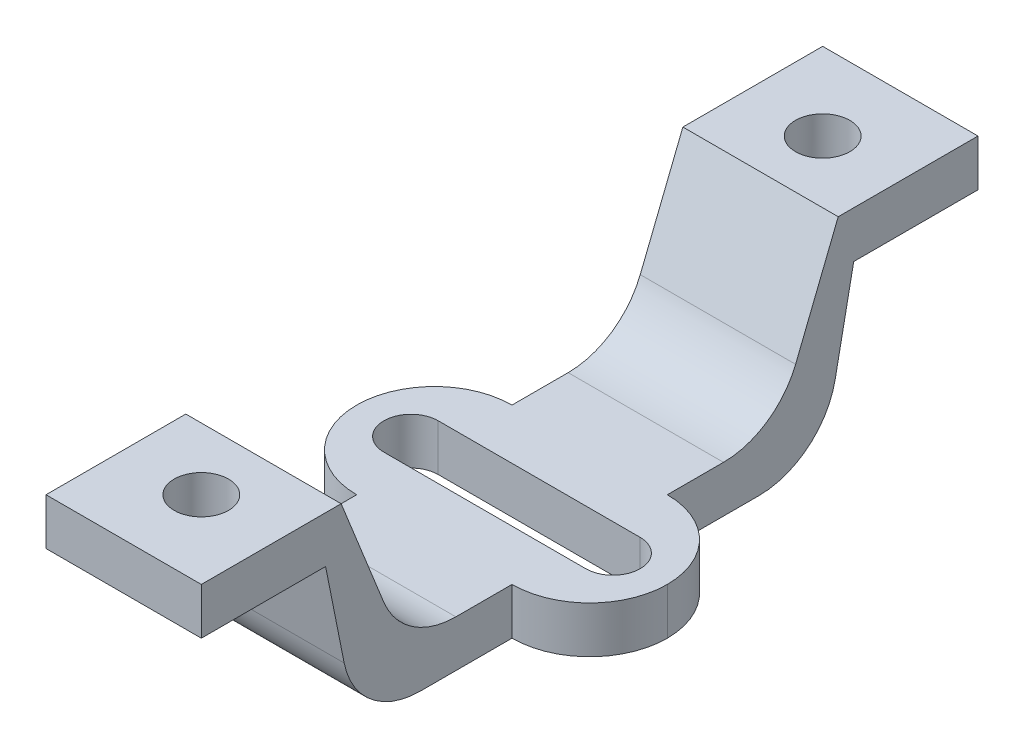
ISO-10303-21;
HEADER;
FILE_DESCRIPTION(('STEP AP214'),'2;1');
FILE_NAME('part.step','',(''),(''),'','','');
FILE_SCHEMA(('AUTOMOTIVE_DESIGN { 1 0 10303 214 1 1 1 1 }'));
ENDSEC;
DATA;
#1=APPLICATION_CONTEXT('core data for automotive mechanical design processes');
#2=APPLICATION_PROTOCOL_DEFINITION('international standard','automotive_design',2000,#1);
#3=PRODUCT_CONTEXT('',#1,'mechanical');
#4=PRODUCT('Part','Part','',(#3));
#5=PRODUCT_RELATED_PRODUCT_CATEGORY('part','',(#4));
#6=PRODUCT_DEFINITION_FORMATION('','',#4);
#7=PRODUCT_DEFINITION_CONTEXT('part definition',#1,'design');
#8=PRODUCT_DEFINITION('design','',#6,#7);
#9=PRODUCT_DEFINITION_SHAPE('','',#8);
#10=(LENGTH_UNIT() NAMED_UNIT(*) SI_UNIT(.MILLI.,.METRE.));
#11=(NAMED_UNIT(*) PLANE_ANGLE_UNIT() SI_UNIT($,.RADIAN.));
#12=(NAMED_UNIT(*) SI_UNIT($,.STERADIAN.) SOLID_ANGLE_UNIT());
#13=UNCERTAINTY_MEASURE_WITH_UNIT(LENGTH_MEASURE(1.E-05),#10,'distance_accuracy_value','');
#14=(GEOMETRIC_REPRESENTATION_CONTEXT(3) GLOBAL_UNCERTAINTY_ASSIGNED_CONTEXT((#13)) GLOBAL_UNIT_ASSIGNED_CONTEXT((#10,
#11,#12)) REPRESENTATION_CONTEXT('',''));
#15=CARTESIAN_POINT('',(0.,0.,0.));
#16=DIRECTION('',(0.,0.,1.));
#17=DIRECTION('',(1.,0.,0.));
#18=AXIS2_PLACEMENT_3D('',#15,#16,#17);
#19=CARTESIAN_POINT('',(6.5,3.,0.));
#20=DIRECTION('',(0.,-1.,0.));
#21=DIRECTION('',(0.,0.,-1.));
#22=AXIS2_PLACEMENT_3D('',#19,#20,#21);
#23=CYLINDRICAL_SURFACE('',#22,1.75);
#24=CARTESIAN_POINT('',(6.5,0.,0.));
#25=DIRECTION('',(0.,1.,0.));
#26=DIRECTION('',(0.,0.,1.));
#27=AXIS2_PLACEMENT_3D('',#24,#25,#26);
#28=CIRCLE('',#27,1.75);
#29=CARTESIAN_POINT('',(6.5,0.,1.75));
#30=VERTEX_POINT('',#29);
#31=CARTESIAN_POINT('',(6.5,0.,-1.75));
#32=VERTEX_POINT('',#31);
#33=EDGE_CURVE('E337',#30,#32,#28,.T.);
#34=ORIENTED_EDGE('',*,*,#33,.F.);
#35=DIRECTION('',(0.,-1.,0.));
#36=VECTOR('',#35,1.);
#37=CARTESIAN_POINT('',(6.5,3.,1.75));
#38=LINE('',#37,#36);
#39=CARTESIAN_POINT('',(6.5,3.,1.75));
#40=VERTEX_POINT('',#39);
#41=EDGE_CURVE('E365',#40,#30,#38,.T.);
#42=ORIENTED_EDGE('',*,*,#41,.F.);
#43=CARTESIAN_POINT('',(6.5,3.,0.));
#44=DIRECTION('',(0.,1.,0.));
#45=DIRECTION('',(0.,0.,1.));
#46=AXIS2_PLACEMENT_3D('',#43,#44,#45);
#47=CIRCLE('',#46,1.75);
#48=CARTESIAN_POINT('',(6.5,3.,-1.75));
#49=VERTEX_POINT('',#48);
#50=EDGE_CURVE('E338',#40,#49,#47,.T.);
#51=ORIENTED_EDGE('',*,*,#50,.T.);
#52=DIRECTION('',(0.,-1.,0.));
#53=VECTOR('',#52,1.);
#54=CARTESIAN_POINT('',(6.5,3.,-1.75));
#55=LINE('',#54,#53);
#56=EDGE_CURVE('E349',#49,#32,#55,.T.);
#57=ORIENTED_EDGE('',*,*,#56,.T.);
#58=EDGE_LOOP('',(#34,#42,#51,#57));
#59=FACE_BOUND('',#58,.T.);
#60=ADVANCED_FACE('F39',(#59),#23,.F.);
#61=CARTESIAN_POINT('',(0.,3.,1.75));
#62=DIRECTION('',(0.,0.,1.));
#63=DIRECTION('',(1.,0.,0.));
#64=AXIS2_PLACEMENT_3D('',#61,#62,#63);
#65=PLANE('',#64);
#66=DIRECTION('',(-1.,0.,0.));
#67=VECTOR('',#66,1.);
#68=CARTESIAN_POINT('',(0.,0.,1.75));
#69=LINE('',#68,#67);
#70=CARTESIAN_POINT('',(-6.5,0.,1.75));
#71=VERTEX_POINT('',#70);
#72=EDGE_CURVE('E352',#30,#71,#69,.T.);
#73=ORIENTED_EDGE('',*,*,#72,.T.);
#74=DIRECTION('',(0.,-1.,0.));
#75=VECTOR('',#74,1.);
#76=CARTESIAN_POINT('',(-6.5,3.,1.75));
#77=LINE('',#76,#75);
#78=CARTESIAN_POINT('',(-6.5,3.,1.75));
#79=VERTEX_POINT('',#78);
#80=EDGE_CURVE('E363',#79,#71,#77,.T.);
#81=ORIENTED_EDGE('',*,*,#80,.F.);
#82=DIRECTION('',(-1.,0.,0.));
#83=VECTOR('',#82,1.);
#84=CARTESIAN_POINT('',(0.,3.,1.75));
#85=LINE('',#84,#83);
#86=EDGE_CURVE('E341',#40,#79,#85,.T.);
#87=ORIENTED_EDGE('',*,*,#86,.F.);
#88=ORIENTED_EDGE('',*,*,#41,.T.);
#89=EDGE_LOOP('',(#73,#81,#87,#88));
#90=FACE_BOUND('',#89,.T.);
#91=ADVANCED_FACE('F495',(#90),#65,.F.);
#92=CARTESIAN_POINT('',(-6.5,3.,0.));
#93=DIRECTION('',(0.,-1.,0.));
#94=DIRECTION('',(0.,0.,-1.));
#95=AXIS2_PLACEMENT_3D('',#92,#93,#94);
#96=CYLINDRICAL_SURFACE('',#95,1.75);
#97=CARTESIAN_POINT('',(-6.5,0.,0.));
#98=DIRECTION('',(0.,1.,0.));
#99=DIRECTION('',(0.,0.,1.));
#100=AXIS2_PLACEMENT_3D('',#97,#98,#99);
#101=CIRCLE('',#100,1.75);
#102=CARTESIAN_POINT('',(-6.5,0.,-1.75));
#103=VERTEX_POINT('',#102);
#104=EDGE_CURVE('E355',#103,#71,#101,.T.);
#105=ORIENTED_EDGE('',*,*,#104,.F.);
#106=DIRECTION('',(0.,-1.,0.));
#107=VECTOR('',#106,1.);
#108=CARTESIAN_POINT('',(-6.5,3.,-1.75));
#109=LINE('',#108,#107);
#110=CARTESIAN_POINT('',(-6.5,3.,-1.75));
#111=VERTEX_POINT('',#110);
#112=EDGE_CURVE('E361',#111,#103,#109,.T.);
#113=ORIENTED_EDGE('',*,*,#112,.F.);
#114=CARTESIAN_POINT('',(-6.5,3.,0.));
#115=DIRECTION('',(0.,1.,0.));
#116=DIRECTION('',(0.,0.,1.));
#117=AXIS2_PLACEMENT_3D('',#114,#115,#116);
#118=CIRCLE('',#117,1.75);
#119=EDGE_CURVE('E344',#111,#79,#118,.T.);
#120=ORIENTED_EDGE('',*,*,#119,.T.);
#121=ORIENTED_EDGE('',*,*,#80,.T.);
#122=EDGE_LOOP('',(#105,#113,#120,#121));
#123=FACE_BOUND('',#122,.T.);
#124=ADVANCED_FACE('F489',(#123),#96,.F.);
#125=CARTESIAN_POINT('',(0.,3.,-1.75));
#126=DIRECTION('',(0.,0.,-1.));
#127=DIRECTION('',(-1.,0.,0.));
#128=AXIS2_PLACEMENT_3D('',#125,#126,#127);
#129=PLANE('',#128);
#130=DIRECTION('',(1.,0.,0.));
#131=VECTOR('',#130,1.);
#132=CARTESIAN_POINT('',(0.,0.,-1.75));
#133=LINE('',#132,#131);
#134=EDGE_CURVE('E342',#103,#32,#133,.T.);
#135=ORIENTED_EDGE('',*,*,#134,.T.);
#136=ORIENTED_EDGE('',*,*,#56,.F.);
#137=DIRECTION('',(1.,0.,0.));
#138=VECTOR('',#137,1.);
#139=CARTESIAN_POINT('',(0.,3.,-1.75));
#140=LINE('',#139,#138);
#141=EDGE_CURVE('E347',#111,#49,#140,.T.);
#142=ORIENTED_EDGE('',*,*,#141,.F.);
#143=ORIENTED_EDGE('',*,*,#112,.T.);
#144=EDGE_LOOP('',(#135,#136,#142,#143));
#145=FACE_BOUND('',#144,.T.);
#146=ADVANCED_FACE('F478',(#145),#129,.F.);
#147=CARTESIAN_POINT('',(0.,3.,0.));
#148=DIRECTION('',(0.,1.,0.));
#149=DIRECTION('',(0.,0.,1.));
#150=AXIS2_PLACEMENT_3D('',#147,#148,#149);
#151=PLANE('',#150);
#152=ORIENTED_EDGE('',*,*,#50,.F.);
#153=ORIENTED_EDGE('',*,*,#86,.T.);
#154=ORIENTED_EDGE('',*,*,#119,.F.);
#155=ORIENTED_EDGE('',*,*,#141,.T.);
#156=EDGE_LOOP('',(#152,#153,#154,#155));
#157=FACE_BOUND('',#156,.T.);
#158=CARTESIAN_POINT('',(-5.,3.,0.));
#159=DIRECTION('',(0.,1.,0.));
#160=DIRECTION('',(0.,0.,1.));
#161=AXIS2_PLACEMENT_3D('',#158,#159,#160);
#162=CIRCLE('',#161,5.);
#163=CARTESIAN_POINT('',(-5.,3.,-5.));
#164=VERTEX_POINT('',#163);
#165=CARTESIAN_POINT('',(-10.,3.,0.));
#166=VERTEX_POINT('',#165);
#167=EDGE_CURVE('E48',#164,#166,#162,.T.);
#168=ORIENTED_EDGE('',*,*,#167,.T.);
#169=CARTESIAN_POINT('',(-5.,3.,0.));
#170=DIRECTION('',(0.,1.,0.));
#171=DIRECTION('',(0.,0.,1.));
#172=AXIS2_PLACEMENT_3D('',#169,#170,#171);
#173=CIRCLE('',#172,5.);
#174=CARTESIAN_POINT('',(-5.,3.,5.));
#175=VERTEX_POINT('',#174);
#176=EDGE_CURVE('E11',#166,#175,#173,.T.);
#177=ORIENTED_EDGE('',*,*,#176,.T.);
#178=DIRECTION('',(0.,0.,-1.));
#179=VECTOR('',#178,1.);
#180=CARTESIAN_POINT('',(-5.,3.,0.));
#181=LINE('',#180,#179);
#182=CARTESIAN_POINT('',(-5.,3.,8.61483519286549));
#183=VERTEX_POINT('',#182);
#184=EDGE_CURVE('E318',#183,#175,#181,.T.);
#185=ORIENTED_EDGE('',*,*,#184,.F.);
#186=DIRECTION('',(-1.,0.,0.));
#187=VECTOR('',#186,1.);
#188=CARTESIAN_POINT('',(5.,3.,8.61483519286549));
#189=LINE('',#188,#187);
#190=CARTESIAN_POINT('',(5.,3.,8.61483519286549));
#191=VERTEX_POINT('',#190);
#192=EDGE_CURVE('E383',#183,#191,#189,.F.);
#193=ORIENTED_EDGE('',*,*,#192,.T.);
#194=DIRECTION('',(0.,0.,-1.));
#195=VECTOR('',#194,1.);
#196=CARTESIAN_POINT('',(5.,3.,0.));
#197=LINE('',#196,#195);
#198=CARTESIAN_POINT('',(5.,3.,5.));
#199=VERTEX_POINT('',#198);
#200=EDGE_CURVE('E296',#191,#199,#197,.T.);
#201=ORIENTED_EDGE('',*,*,#200,.T.);
#202=CARTESIAN_POINT('',(5.,3.,0.));
#203=DIRECTION('',(0.,1.,0.));
#204=DIRECTION('',(0.,0.,1.));
#205=AXIS2_PLACEMENT_3D('',#202,#203,#204);
#206=CIRCLE('',#205,5.);
#207=CARTESIAN_POINT('',(10.,3.,0.));
#208=VERTEX_POINT('',#207);
#209=EDGE_CURVE('E56',#199,#208,#206,.T.);
#210=ORIENTED_EDGE('',*,*,#209,.T.);
#211=CARTESIAN_POINT('',(5.,3.,0.));
#212=DIRECTION('',(0.,1.,0.));
#213=DIRECTION('',(0.,0.,1.));
#214=AXIS2_PLACEMENT_3D('',#211,#212,#213);
#215=CIRCLE('',#214,5.);
#216=CARTESIAN_POINT('',(5.,3.,-5.));
#217=VERTEX_POINT('',#216);
#218=EDGE_CURVE('E415',#208,#217,#215,.T.);
#219=ORIENTED_EDGE('',*,*,#218,.T.);
#220=DIRECTION('',(0.,0.,-1.));
#221=VECTOR('',#220,1.);
#222=CARTESIAN_POINT('',(5.,3.,0.));
#223=LINE('',#222,#221);
#224=CARTESIAN_POINT('',(5.,3.,-8.61483519286549));
#225=VERTEX_POINT('',#224);
#226=EDGE_CURVE('E222',#217,#225,#223,.T.);
#227=ORIENTED_EDGE('',*,*,#226,.T.);
#228=DIRECTION('',(-1.,0.,0.));
#229=VECTOR('',#228,1.);
#230=CARTESIAN_POINT('',(-5.,3.,-8.61483519286549));
#231=LINE('',#230,#229);
#232=CARTESIAN_POINT('',(-5.,3.,-8.61483519286549));
#233=VERTEX_POINT('',#232);
#234=EDGE_CURVE('E385',#225,#233,#231,.T.);
#235=ORIENTED_EDGE('',*,*,#234,.T.);
#236=DIRECTION('',(0.,0.,-1.));
#237=VECTOR('',#236,1.);
#238=CARTESIAN_POINT('',(-5.,3.,0.));
#239=LINE('',#238,#237);
#240=EDGE_CURVE('E265',#164,#233,#239,.T.);
#241=ORIENTED_EDGE('',*,*,#240,.F.);
#242=EDGE_LOOP('',(#168,#177,#185,#193,#201,#210,#219,#227,#235,#241));
#243=FACE_BOUND('',#242,.T.);
#244=ADVANCED_FACE('F476',(#157,#243),#151,.T.);
#245=CARTESIAN_POINT('',(0.,0.,0.));
#246=DIRECTION('',(0.,1.,0.));
#247=DIRECTION('',(0.,0.,1.));
#248=AXIS2_PLACEMENT_3D('',#245,#246,#247);
#249=PLANE('',#248);
#250=ORIENTED_EDGE('',*,*,#33,.T.);
#251=ORIENTED_EDGE('',*,*,#134,.F.);
#252=ORIENTED_EDGE('',*,*,#104,.T.);
#253=ORIENTED_EDGE('',*,*,#72,.F.);
#254=EDGE_LOOP('',(#250,#251,#252,#253));
#255=FACE_BOUND('',#254,.T.);
#256=DIRECTION('',(0.,0.,-1.));
#257=VECTOR('',#256,1.);
#258=CARTESIAN_POINT('',(-5.,0.,0.));
#259=LINE('',#258,#257);
#260=CARTESIAN_POINT('',(-5.,0.,10.9009804864072));
#261=VERTEX_POINT('',#260);
#262=CARTESIAN_POINT('',(-5.,0.,5.));
#263=VERTEX_POINT('',#262);
#264=EDGE_CURVE('E312',#261,#263,#259,.T.);
#265=ORIENTED_EDGE('',*,*,#264,.T.);
#266=CARTESIAN_POINT('',(-5.,0.,0.));
#267=DIRECTION('',(0.,1.,0.));
#268=DIRECTION('',(0.,0.,1.));
#269=AXIS2_PLACEMENT_3D('',#266,#267,#268);
#270=CIRCLE('',#269,5.);
#271=CARTESIAN_POINT('',(-10.,0.,0.));
#272=VERTEX_POINT('',#271);
#273=EDGE_CURVE('E412',#263,#272,#270,.F.);
#274=ORIENTED_EDGE('',*,*,#273,.T.);
#275=CARTESIAN_POINT('',(-5.,0.,0.));
#276=DIRECTION('',(0.,1.,0.));
#277=DIRECTION('',(0.,0.,1.));
#278=AXIS2_PLACEMENT_3D('',#275,#276,#277);
#279=CIRCLE('',#278,5.);
#280=CARTESIAN_POINT('',(-5.,0.,-5.));
#281=VERTEX_POINT('',#280);
#282=EDGE_CURVE('E410',#272,#281,#279,.F.);
#283=ORIENTED_EDGE('',*,*,#282,.T.);
#284=DIRECTION('',(0.,0.,-1.));
#285=VECTOR('',#284,1.);
#286=CARTESIAN_POINT('',(-5.,0.,0.));
#287=LINE('',#286,#285);
#288=CARTESIAN_POINT('',(-5.,0.,-10.9009804864072));
#289=VERTEX_POINT('',#288);
#290=EDGE_CURVE('E271',#281,#289,#287,.T.);
#291=ORIENTED_EDGE('',*,*,#290,.T.);
#292=DIRECTION('',(-1.,0.,0.));
#293=VECTOR('',#292,1.);
#294=CARTESIAN_POINT('',(0.,0.,-10.9009804864072));
#295=LINE('',#294,#293);
#296=CARTESIAN_POINT('',(5.,0.,-10.9009804864072));
#297=VERTEX_POINT('',#296);
#298=EDGE_CURVE('E379',#289,#297,#295,.F.);
#299=ORIENTED_EDGE('',*,*,#298,.T.);
#300=DIRECTION('',(0.,0.,-1.));
#301=VECTOR('',#300,1.);
#302=CARTESIAN_POINT('',(5.,0.,0.));
#303=LINE('',#302,#301);
#304=CARTESIAN_POINT('',(5.,0.,-5.));
#305=VERTEX_POINT('',#304);
#306=EDGE_CURVE('E253',#305,#297,#303,.T.);
#307=ORIENTED_EDGE('',*,*,#306,.F.);
#308=CARTESIAN_POINT('',(5.,0.,0.));
#309=DIRECTION('',(0.,1.,0.));
#310=DIRECTION('',(0.,0.,1.));
#311=AXIS2_PLACEMENT_3D('',#308,#309,#310);
#312=CIRCLE('',#311,5.);
#313=CARTESIAN_POINT('',(10.,0.,0.));
#314=VERTEX_POINT('',#313);
#315=EDGE_CURVE('E408',#305,#314,#312,.F.);
#316=ORIENTED_EDGE('',*,*,#315,.T.);
#317=CARTESIAN_POINT('',(5.,0.,0.));
#318=DIRECTION('',(0.,1.,0.));
#319=DIRECTION('',(0.,0.,1.));
#320=AXIS2_PLACEMENT_3D('',#317,#318,#319);
#321=CIRCLE('',#320,5.);
#322=CARTESIAN_POINT('',(5.,0.,5.));
#323=VERTEX_POINT('',#322);
#324=EDGE_CURVE('E406',#314,#323,#321,.F.);
#325=ORIENTED_EDGE('',*,*,#324,.T.);
#326=DIRECTION('',(0.,0.,-1.));
#327=VECTOR('',#326,1.);
#328=CARTESIAN_POINT('',(5.,0.,0.));
#329=LINE('',#328,#327);
#330=CARTESIAN_POINT('',(5.,0.,10.9009804864072));
#331=VERTEX_POINT('',#330);
#332=EDGE_CURVE('E290',#331,#323,#329,.T.);
#333=ORIENTED_EDGE('',*,*,#332,.F.);
#334=DIRECTION('',(-1.,0.,0.));
#335=VECTOR('',#334,1.);
#336=CARTESIAN_POINT('',(0.,0.,10.9009804864072));
#337=LINE('',#336,#335);
#338=EDGE_CURVE('E376',#331,#261,#337,.T.);
#339=ORIENTED_EDGE('',*,*,#338,.T.);
#340=EDGE_LOOP('',(#265,#274,#283,#291,#299,#307,#316,#325,#333,#339));
#341=FACE_BOUND('',#340,.T.);
#342=ADVANCED_FACE('F433',(#255,#341),#249,.F.);
#343=CARTESIAN_POINT('',(5.,10.,0.));
#344=DIRECTION('',(0.,1.,0.));
#345=DIRECTION('',(0.,0.,1.));
#346=AXIS2_PLACEMENT_3D('',#343,#344,#345);
#347=PLANE('',#346);
#348=CARTESIAN_POINT('',(0.,10.,20.));
#349=DIRECTION('',(0.,1.,0.));
#350=DIRECTION('',(0.,0.,1.));
#351=AXIS2_PLACEMENT_3D('',#348,#349,#350);
#352=CIRCLE('',#351,1.75);
#353=CARTESIAN_POINT('',(0.,10.,21.75));
#354=VERTEX_POINT('',#353);
#355=EDGE_CURVE('E245',#354,#354,#352,.T.);
#356=ORIENTED_EDGE('',*,*,#355,.T.);
#357=EDGE_LOOP('',(#356));
#358=FACE_BOUND('',#357,.T.);
#359=DIRECTION('',(0.,0.,-1.));
#360=VECTOR('',#359,1.);
#361=CARTESIAN_POINT('',(-5.,10.,0.));
#362=LINE('',#361,#360);
#363=CARTESIAN_POINT('',(-5.,10.,25.));
#364=VERTEX_POINT('',#363);
#365=CARTESIAN_POINT('',(-5.,10.,17.));
#366=VERTEX_POINT('',#365);
#367=EDGE_CURVE('E231',#364,#366,#362,.T.);
#368=ORIENTED_EDGE('',*,*,#367,.T.);
#369=DIRECTION('',(-1.,0.,0.));
#370=VECTOR('',#369,1.);
#371=CARTESIAN_POINT('',(5.,10.,17.));
#372=LINE('',#371,#370);
#373=CARTESIAN_POINT('',(5.,10.,17.));
#374=VERTEX_POINT('',#373);
#375=EDGE_CURVE('E334',#374,#366,#372,.T.);
#376=ORIENTED_EDGE('',*,*,#375,.F.);
#377=DIRECTION('',(0.,0.,-1.));
#378=VECTOR('',#377,1.);
#379=CARTESIAN_POINT('',(5.,10.,0.));
#380=LINE('',#379,#378);
#381=CARTESIAN_POINT('',(5.,10.,25.));
#382=VERTEX_POINT('',#381);
#383=EDGE_CURVE('E283',#382,#374,#380,.T.);
#384=ORIENTED_EDGE('',*,*,#383,.F.);
#385=DIRECTION('',(-1.,0.,0.));
#386=VECTOR('',#385,1.);
#387=CARTESIAN_POINT('',(5.,10.,25.));
#388=LINE('',#387,#386);
#389=EDGE_CURVE('E306',#382,#364,#388,.T.);
#390=ORIENTED_EDGE('',*,*,#389,.T.);
#391=EDGE_LOOP('',(#368,#376,#384,#390));
#392=FACE_BOUND('',#391,.T.);
#393=ADVANCED_FACE('F485',(#358,#392),#347,.F.);
#394=CARTESIAN_POINT('',(5.,-2.88461538461539,14.4230769230769));
#395=DIRECTION('',(0.,0.196116135138184,-0.98058067569092));
#396=DIRECTION('',(0.,0.98058067569092,0.196116135138184));
#397=AXIS2_PLACEMENT_3D('',#394,#395,#396);
#398=PLANE('',#397);
#399=DIRECTION('',(0.,-0.98058067569092,-0.196116135138184));
#400=VECTOR('',#399,1.);
#401=CARTESIAN_POINT('',(-5.,-2.88461538461539,14.4230769230769));
#402=LINE('',#401,#400);
#403=CARTESIAN_POINT('',(-5.,4.01941932430908,15.8038838648618));
#404=VERTEX_POINT('',#403);
#405=EDGE_CURVE('E309',#366,#404,#402,.T.);
#406=ORIENTED_EDGE('',*,*,#405,.T.);
#407=DIRECTION('',(-1.,0.,0.));
#408=VECTOR('',#407,1.);
#409=CARTESIAN_POINT('',(5.,4.01941932430908,15.8038838648618));
#410=LINE('',#409,#408);
#411=CARTESIAN_POINT('',(5.,4.01941932430908,15.8038838648618));
#412=VERTEX_POINT('',#411);
#413=EDGE_CURVE('E394',#404,#412,#410,.F.);
#414=ORIENTED_EDGE('',*,*,#413,.T.);
#415=DIRECTION('',(0.,-0.98058067569092,-0.196116135138184));
#416=VECTOR('',#415,1.);
#417=CARTESIAN_POINT('',(5.,-2.88461538461539,14.4230769230769));
#418=LINE('',#417,#416);
#419=EDGE_CURVE('E286',#374,#412,#418,.T.);
#420=ORIENTED_EDGE('',*,*,#419,.F.);
#421=ORIENTED_EDGE('',*,*,#375,.T.);
#422=EDGE_LOOP('',(#406,#414,#420,#421));
#423=FACE_BOUND('',#422,.T.);
#424=ADVANCED_FACE('F656',(#423),#398,.F.);
#425=CARTESIAN_POINT('',(5.,-3.72413793103448,9.3103448275862));
#426=DIRECTION('',(0.,0.371390676354104,-0.928476690885259));
#427=DIRECTION('',(0.,0.928476690885259,0.371390676354104));
#428=AXIS2_PLACEMENT_3D('',#425,#426,#427);
#429=PLANE('',#428);
#430=DIRECTION('',(0.,-0.928476690885259,-0.371390676354104));
#431=VECTOR('',#430,1.);
#432=CARTESIAN_POINT('',(5.,-3.72413793103448,9.3103448275862));
#433=LINE('',#432,#431);
#434=CARTESIAN_POINT('',(5.,13.,16.));
#435=VERTEX_POINT('',#434);
#436=CARTESIAN_POINT('',(5.,6.14304661822948,13.2572186472918));
#437=VERTEX_POINT('',#436);
#438=EDGE_CURVE('E298',#435,#437,#433,.T.);
#439=ORIENTED_EDGE('',*,*,#438,.T.);
#440=DIRECTION('',(-1.,0.,0.));
#441=VECTOR('',#440,1.);
#442=CARTESIAN_POINT('',(-5.,6.14304661822948,13.2572186472918));
#443=LINE('',#442,#441);
#444=CARTESIAN_POINT('',(-5.,6.14304661822948,13.2572186472918));
#445=VERTEX_POINT('',#444);
#446=EDGE_CURVE('E389',#437,#445,#443,.T.);
#447=ORIENTED_EDGE('',*,*,#446,.T.);
#448=DIRECTION('',(0.,-0.928476690885259,-0.371390676354104));
#449=VECTOR('',#448,1.);
#450=CARTESIAN_POINT('',(-5.,-3.72413793103448,9.3103448275862));
#451=LINE('',#450,#449);
#452=CARTESIAN_POINT('',(-5.,13.,16.));
#453=VERTEX_POINT('',#452);
#454=EDGE_CURVE('E321',#453,#445,#451,.T.);
#455=ORIENTED_EDGE('',*,*,#454,.F.);
#456=DIRECTION('',(-1.,0.,0.));
#457=VECTOR('',#456,1.);
#458=CARTESIAN_POINT('',(5.,13.,16.));
#459=LINE('',#458,#457);
#460=EDGE_CURVE('E332',#435,#453,#459,.T.);
#461=ORIENTED_EDGE('',*,*,#460,.F.);
#462=EDGE_LOOP('',(#439,#447,#455,#461));
#463=FACE_BOUND('',#462,.T.);
#464=ADVANCED_FACE('F648',(#463),#429,.T.);
#465=CARTESIAN_POINT('',(5.,13.,0.));
#466=DIRECTION('',(0.,1.,0.));
#467=DIRECTION('',(0.,0.,1.));
#468=AXIS2_PLACEMENT_3D('',#465,#466,#467);
#469=PLANE('',#468);
#470=CARTESIAN_POINT('',(0.,13.,20.));
#471=DIRECTION('',(0.,1.,0.));
#472=DIRECTION('',(0.,0.,1.));
#473=AXIS2_PLACEMENT_3D('',#470,#471,#472);
#474=CIRCLE('',#473,1.75);
#475=CARTESIAN_POINT('',(0.,13.,21.75));
#476=VERTEX_POINT('',#475);
#477=EDGE_CURVE('E419',#476,#476,#474,.T.);
#478=ORIENTED_EDGE('',*,*,#477,.F.);
#479=EDGE_LOOP('',(#478));
#480=FACE_BOUND('',#479,.T.);
#481=DIRECTION('',(0.,0.,-1.));
#482=VECTOR('',#481,1.);
#483=CARTESIAN_POINT('',(-5.,13.,0.));
#484=LINE('',#483,#482);
#485=CARTESIAN_POINT('',(-5.,13.,25.));
#486=VERTEX_POINT('',#485);
#487=EDGE_CURVE('E324',#486,#453,#484,.T.);
#488=ORIENTED_EDGE('',*,*,#487,.F.);
#489=DIRECTION('',(-1.,0.,0.));
#490=VECTOR('',#489,1.);
#491=CARTESIAN_POINT('',(5.,13.,25.));
#492=LINE('',#491,#490);
#493=CARTESIAN_POINT('',(5.,13.,25.));
#494=VERTEX_POINT('',#493);
#495=EDGE_CURVE('E330',#494,#486,#492,.T.);
#496=ORIENTED_EDGE('',*,*,#495,.F.);
#497=DIRECTION('',(0.,0.,-1.));
#498=VECTOR('',#497,1.);
#499=CARTESIAN_POINT('',(5.,13.,0.));
#500=LINE('',#499,#498);
#501=EDGE_CURVE('E301',#494,#435,#500,.T.);
#502=ORIENTED_EDGE('',*,*,#501,.T.);
#503=ORIENTED_EDGE('',*,*,#460,.T.);
#504=EDGE_LOOP('',(#488,#496,#502,#503));
#505=FACE_BOUND('',#504,.T.);
#506=ADVANCED_FACE('F640',(#480,#505),#469,.T.);
#507=CARTESIAN_POINT('',(5.,0.,25.));
#508=DIRECTION('',(0.,0.,-1.));
#509=DIRECTION('',(-1.,0.,0.));
#510=AXIS2_PLACEMENT_3D('',#507,#508,#509);
#511=PLANE('',#510);
#512=DIRECTION('',(0.,-1.,0.));
#513=VECTOR('',#512,1.);
#514=CARTESIAN_POINT('',(-5.,0.,25.));
#515=LINE('',#514,#513);
#516=EDGE_CURVE('E287',#486,#364,#515,.T.);
#517=ORIENTED_EDGE('',*,*,#516,.T.);
#518=ORIENTED_EDGE('',*,*,#389,.F.);
#519=DIRECTION('',(0.,-1.,0.));
#520=VECTOR('',#519,1.);
#521=CARTESIAN_POINT('',(5.,0.,25.));
#522=LINE('',#521,#520);
#523=EDGE_CURVE('E304',#494,#382,#522,.T.);
#524=ORIENTED_EDGE('',*,*,#523,.F.);
#525=ORIENTED_EDGE('',*,*,#495,.T.);
#526=EDGE_LOOP('',(#517,#518,#524,#525));
#527=FACE_BOUND('',#526,.T.);
#528=ADVANCED_FACE('F632',(#527),#511,.F.);
#529=CARTESIAN_POINT('',(5.,0.,0.));
#530=DIRECTION('',(1.,0.,0.));
#531=DIRECTION('',(0.,0.,-1.));
#532=AXIS2_PLACEMENT_3D('',#529,#530,#531);
#533=PLANE('',#532);
#534=ORIENTED_EDGE('',*,*,#419,.T.);
#535=CARTESIAN_POINT('',(5.,5.,10.9009804864072));
#536=DIRECTION('',(1.,0.,0.));
#537=DIRECTION('',(0.,0.,-1.));
#538=AXIS2_PLACEMENT_3D('',#535,#536,#537);
#539=CIRCLE('',#538,5.);
#540=EDGE_CURVE('E396',#412,#331,#539,.T.);
#541=ORIENTED_EDGE('',*,*,#540,.T.);
#542=ORIENTED_EDGE('',*,*,#332,.T.);
#543=DIRECTION('',(0.,-1.,0.));
#544=VECTOR('',#543,1.);
#545=CARTESIAN_POINT('',(5.,0.,5.));
#546=LINE('',#545,#544);
#547=EDGE_CURVE('E293',#199,#323,#546,.T.);
#548=ORIENTED_EDGE('',*,*,#547,.F.);
#549=ORIENTED_EDGE('',*,*,#200,.F.);
#550=CARTESIAN_POINT('',(5.,8.,8.61483519286549));
#551=DIRECTION('',(1.,0.,0.));
#552=DIRECTION('',(0.,0.,-1.));
#553=AXIS2_PLACEMENT_3D('',#550,#551,#552);
#554=CIRCLE('',#553,5.);
#555=EDGE_CURVE('E404',#191,#437,#554,.F.);
#556=ORIENTED_EDGE('',*,*,#555,.T.);
#557=ORIENTED_EDGE('',*,*,#438,.F.);
#558=ORIENTED_EDGE('',*,*,#501,.F.);
#559=ORIENTED_EDGE('',*,*,#523,.T.);
#560=ORIENTED_EDGE('',*,*,#383,.T.);
#561=EDGE_LOOP('',(#534,#541,#542,#548,#549,#556,#557,#558,#559,#560));
#562=FACE_BOUND('',#561,.T.);
#563=ADVANCED_FACE('F436',(#562),#533,.T.);
#564=CARTESIAN_POINT('',(-5.,0.,0.));
#565=DIRECTION('',(1.,0.,0.));
#566=DIRECTION('',(0.,0.,-1.));
#567=AXIS2_PLACEMENT_3D('',#564,#565,#566);
#568=PLANE('',#567);
#569=ORIENTED_EDGE('',*,*,#264,.F.);
#570=CARTESIAN_POINT('',(-5.,5.,10.9009804864072));
#571=DIRECTION('',(1.,0.,0.));
#572=DIRECTION('',(0.,0.,-1.));
#573=AXIS2_PLACEMENT_3D('',#570,#571,#572);
#574=CIRCLE('',#573,5.);
#575=EDGE_CURVE('E392',#261,#404,#574,.F.);
#576=ORIENTED_EDGE('',*,*,#575,.T.);
#577=ORIENTED_EDGE('',*,*,#405,.F.);
#578=ORIENTED_EDGE('',*,*,#367,.F.);
#579=ORIENTED_EDGE('',*,*,#516,.F.);
#580=ORIENTED_EDGE('',*,*,#487,.T.);
#581=ORIENTED_EDGE('',*,*,#454,.T.);
#582=CARTESIAN_POINT('',(-5.,8.,8.61483519286549));
#583=DIRECTION('',(1.,0.,0.));
#584=DIRECTION('',(0.,0.,-1.));
#585=AXIS2_PLACEMENT_3D('',#582,#583,#584);
#586=CIRCLE('',#585,5.);
#587=EDGE_CURVE('E402',#445,#183,#586,.T.);
#588=ORIENTED_EDGE('',*,*,#587,.T.);
#589=ORIENTED_EDGE('',*,*,#184,.T.);
#590=DIRECTION('',(0.,-1.,0.));
#591=VECTOR('',#590,1.);
#592=CARTESIAN_POINT('',(-5.,0.,5.));
#593=LINE('',#592,#591);
#594=EDGE_CURVE('E315',#175,#263,#593,.T.);
#595=ORIENTED_EDGE('',*,*,#594,.T.);
#596=EDGE_LOOP('',(#569,#576,#577,#578,#579,#580,#581,#588,#589,#595));
#597=FACE_BOUND('',#596,.T.);
#598=ADVANCED_FACE('F444',(#597),#568,.F.);
#599=CARTESIAN_POINT('',(5.,13.,0.));
#600=DIRECTION('',(0.,1.,0.));
#601=DIRECTION('',(0.,0.,1.));
#602=AXIS2_PLACEMENT_3D('',#599,#600,#601);
#603=PLANE('',#602);
#604=CARTESIAN_POINT('',(0.,13.,-20.));
#605=DIRECTION('',(0.,1.,0.));
#606=DIRECTION('',(0.,0.,1.));
#607=AXIS2_PLACEMENT_3D('',#604,#605,#606);
#608=CIRCLE('',#607,1.75);
#609=CARTESIAN_POINT('',(0.,13.,-18.25));
#610=VERTEX_POINT('',#609);
#611=EDGE_CURVE('E371',#610,#610,#608,.T.);
#612=ORIENTED_EDGE('',*,*,#611,.F.);
#613=EDGE_LOOP('',(#612));
#614=FACE_BOUND('',#613,.T.);
#615=DIRECTION('',(0.,0.,-1.));
#616=VECTOR('',#615,1.);
#617=CARTESIAN_POINT('',(-5.,13.,0.));
#618=LINE('',#617,#616);
#619=CARTESIAN_POINT('',(-5.,13.,-16.));
#620=VERTEX_POINT('',#619);
#621=CARTESIAN_POINT('',(-5.,13.,-25.));
#622=VERTEX_POINT('',#621);
#623=EDGE_CURVE('E230',#620,#622,#618,.T.);
#624=ORIENTED_EDGE('',*,*,#623,.F.);
#625=DIRECTION('',(-1.,0.,0.));
#626=VECTOR('',#625,1.);
#627=CARTESIAN_POINT('',(5.,13.,-16.));
#628=LINE('',#627,#626);
#629=CARTESIAN_POINT('',(5.,13.,-16.));
#630=VERTEX_POINT('',#629);
#631=EDGE_CURVE('E215',#630,#620,#628,.T.);
#632=ORIENTED_EDGE('',*,*,#631,.F.);
#633=DIRECTION('',(0.,0.,-1.));
#634=VECTOR('',#633,1.);
#635=CARTESIAN_POINT('',(5.,13.,0.));
#636=LINE('',#635,#634);
#637=CARTESIAN_POINT('',(5.,13.,-25.));
#638=VERTEX_POINT('',#637);
#639=EDGE_CURVE('E223',#630,#638,#636,.T.);
#640=ORIENTED_EDGE('',*,*,#639,.T.);
#641=DIRECTION('',(-1.,0.,0.));
#642=VECTOR('',#641,1.);
#643=CARTESIAN_POINT('',(5.,13.,-25.));
#644=LINE('',#643,#642);
#645=EDGE_CURVE('E261',#638,#622,#644,.T.);
#646=ORIENTED_EDGE('',*,*,#645,.T.);
#647=EDGE_LOOP('',(#624,#632,#640,#646));
#648=FACE_BOUND('',#647,.T.);
#649=ADVANCED_FACE('F227',(#614,#648),#603,.T.);
#650=CARTESIAN_POINT('',(5.,-3.72413793103448,-9.31034482758621));
#651=DIRECTION('',(0.,0.371390676354104,0.928476690885259));
#652=DIRECTION('',(0.,-0.928476690885259,0.371390676354104));
#653=AXIS2_PLACEMENT_3D('',#650,#651,#652);
#654=PLANE('',#653);
#655=DIRECTION('',(0.,0.928476690885259,-0.371390676354104));
#656=VECTOR('',#655,1.);
#657=CARTESIAN_POINT('',(-5.,-3.72413793103448,-9.31034482758621));
#658=LINE('',#657,#656);
#659=CARTESIAN_POINT('',(-5.,6.14304661822948,-13.2572186472918));
#660=VERTEX_POINT('',#659);
#661=EDGE_CURVE('E263',#660,#620,#658,.T.);
#662=ORIENTED_EDGE('',*,*,#661,.F.);
#663=DIRECTION('',(-1.,0.,0.));
#664=VECTOR('',#663,1.);
#665=CARTESIAN_POINT('',(5.,6.14304661822948,-13.2572186472918));
#666=LINE('',#665,#664);
#667=CARTESIAN_POINT('',(5.,6.14304661822948,-13.2572186472918));
#668=VERTEX_POINT('',#667);
#669=EDGE_CURVE('E218',#660,#668,#666,.F.);
#670=ORIENTED_EDGE('',*,*,#669,.T.);
#671=DIRECTION('',(0.,0.928476690885259,-0.371390676354104));
#672=VECTOR('',#671,1.);
#673=CARTESIAN_POINT('',(5.,-3.72413793103448,-9.31034482758621));
#674=LINE('',#673,#672);
#675=EDGE_CURVE('E211',#668,#630,#674,.T.);
#676=ORIENTED_EDGE('',*,*,#675,.T.);
#677=ORIENTED_EDGE('',*,*,#631,.T.);
#678=EDGE_LOOP('',(#662,#670,#676,#677));
#679=FACE_BOUND('',#678,.T.);
#680=ADVANCED_FACE('F214',(#679),#654,.T.);
#681=CARTESIAN_POINT('',(5.,-2.88461538461538,-14.4230769230769));
#682=DIRECTION('',(0.,0.196116135138184,0.98058067569092));
#683=DIRECTION('',(0.,-0.98058067569092,0.196116135138184));
#684=AXIS2_PLACEMENT_3D('',#681,#682,#683);
#685=PLANE('',#684);
#686=DIRECTION('',(0.,0.98058067569092,-0.196116135138184));
#687=VECTOR('',#686,1.);
#688=CARTESIAN_POINT('',(5.,-2.88461538461538,-14.4230769230769));
#689=LINE('',#688,#687);
#690=CARTESIAN_POINT('',(5.,4.01941932430908,-15.8038838648618));
#691=VERTEX_POINT('',#690);
#692=CARTESIAN_POINT('',(5.,10.,-17.));
#693=VERTEX_POINT('',#692);
#694=EDGE_CURVE('E255',#691,#693,#689,.T.);
#695=ORIENTED_EDGE('',*,*,#694,.F.);
#696=DIRECTION('',(-1.,0.,0.));
#697=VECTOR('',#696,1.);
#698=CARTESIAN_POINT('',(5.,4.01941932430908,-15.8038838648618));
#699=LINE('',#698,#697);
#700=CARTESIAN_POINT('',(-5.,4.01941932430908,-15.8038838648618));
#701=VERTEX_POINT('',#700);
#702=EDGE_CURVE('E367',#691,#701,#699,.T.);
#703=ORIENTED_EDGE('',*,*,#702,.T.);
#704=DIRECTION('',(0.,0.98058067569092,-0.196116135138184));
#705=VECTOR('',#704,1.);
#706=CARTESIAN_POINT('',(-5.,-2.88461538461538,-14.4230769230769));
#707=LINE('',#706,#705);
#708=CARTESIAN_POINT('',(-5.,10.,-17.));
#709=VERTEX_POINT('',#708);
#710=EDGE_CURVE('E274',#701,#709,#707,.T.);
#711=ORIENTED_EDGE('',*,*,#710,.T.);
#712=DIRECTION('',(-1.,0.,0.));
#713=VECTOR('',#712,1.);
#714=CARTESIAN_POINT('',(5.,10.,-17.));
#715=LINE('',#714,#713);
#716=EDGE_CURVE('E232',#693,#709,#715,.T.);
#717=ORIENTED_EDGE('',*,*,#716,.F.);
#718=EDGE_LOOP('',(#695,#703,#711,#717));
#719=FACE_BOUND('',#718,.T.);
#720=ADVANCED_FACE('F465',(#719),#685,.F.);
#721=CARTESIAN_POINT('',(5.,10.,0.));
#722=DIRECTION('',(0.,-1.,0.));
#723=DIRECTION('',(0.,0.,-1.));
#724=AXIS2_PLACEMENT_3D('',#721,#722,#723);
#725=PLANE('',#724);
#726=CARTESIAN_POINT('',(0.,10.,-20.));
#727=DIRECTION('',(0.,-1.,0.));
#728=DIRECTION('',(0.,0.,-1.));
#729=AXIS2_PLACEMENT_3D('',#726,#727,#728);
#730=CIRCLE('',#729,1.75);
#731=CARTESIAN_POINT('',(0.,10.,-21.75));
#732=VERTEX_POINT('',#731);
#733=EDGE_CURVE('E368',#732,#732,#730,.T.);
#734=ORIENTED_EDGE('',*,*,#733,.F.);
#735=EDGE_LOOP('',(#734));
#736=FACE_BOUND('',#735,.T.);
#737=DIRECTION('',(0.,0.,1.));
#738=VECTOR('',#737,1.);
#739=CARTESIAN_POINT('',(-5.,10.,0.));
#740=LINE('',#739,#738);
#741=CARTESIAN_POINT('',(-5.,10.,-25.));
#742=VERTEX_POINT('',#741);
#743=EDGE_CURVE('E242',#742,#709,#740,.T.);
#744=ORIENTED_EDGE('',*,*,#743,.F.);
#745=DIRECTION('',(-1.,0.,0.));
#746=VECTOR('',#745,1.);
#747=CARTESIAN_POINT('',(5.,10.,-25.));
#748=LINE('',#747,#746);
#749=CARTESIAN_POINT('',(5.,10.,-25.));
#750=VERTEX_POINT('',#749);
#751=EDGE_CURVE('E279',#750,#742,#748,.T.);
#752=ORIENTED_EDGE('',*,*,#751,.F.);
#753=DIRECTION('',(0.,0.,1.));
#754=VECTOR('',#753,1.);
#755=CARTESIAN_POINT('',(5.,10.,0.));
#756=LINE('',#755,#754);
#757=EDGE_CURVE('E257',#750,#693,#756,.T.);
#758=ORIENTED_EDGE('',*,*,#757,.T.);
#759=ORIENTED_EDGE('',*,*,#716,.T.);
#760=EDGE_LOOP('',(#744,#752,#758,#759));
#761=FACE_BOUND('',#760,.T.);
#762=ADVANCED_FACE('F468',(#736,#761),#725,.T.);
#763=CARTESIAN_POINT('',(5.,0.,-25.));
#764=DIRECTION('',(0.,0.,-1.));
#765=DIRECTION('',(-1.,0.,0.));
#766=AXIS2_PLACEMENT_3D('',#763,#764,#765);
#767=PLANE('',#766);
#768=DIRECTION('',(0.,-1.,0.));
#769=VECTOR('',#768,1.);
#770=CARTESIAN_POINT('',(-5.,0.,-25.));
#771=LINE('',#770,#769);
#772=EDGE_CURVE('E239',#622,#742,#771,.T.);
#773=ORIENTED_EDGE('',*,*,#772,.F.);
#774=ORIENTED_EDGE('',*,*,#645,.F.);
#775=DIRECTION('',(0.,-1.,0.));
#776=VECTOR('',#775,1.);
#777=CARTESIAN_POINT('',(5.,0.,-25.));
#778=LINE('',#777,#776);
#779=EDGE_CURVE('E238',#638,#750,#778,.T.);
#780=ORIENTED_EDGE('',*,*,#779,.T.);
#781=ORIENTED_EDGE('',*,*,#751,.T.);
#782=EDGE_LOOP('',(#773,#774,#780,#781));
#783=FACE_BOUND('',#782,.T.);
#784=ADVANCED_FACE('F471',(#783),#767,.T.);
#785=CARTESIAN_POINT('',(5.,0.,0.));
#786=DIRECTION('',(1.,0.,0.));
#787=DIRECTION('',(0.,0.,-1.));
#788=AXIS2_PLACEMENT_3D('',#785,#786,#787);
#789=PLANE('',#788);
#790=ORIENTED_EDGE('',*,*,#306,.T.);
#791=CARTESIAN_POINT('',(5.,5.,-10.9009804864072));
#792=DIRECTION('',(1.,0.,0.));
#793=DIRECTION('',(0.,0.,-1.));
#794=AXIS2_PLACEMENT_3D('',#791,#792,#793);
#795=CIRCLE('',#794,5.);
#796=EDGE_CURVE('E381',#297,#691,#795,.T.);
#797=ORIENTED_EDGE('',*,*,#796,.T.);
#798=ORIENTED_EDGE('',*,*,#694,.T.);
#799=ORIENTED_EDGE('',*,*,#757,.F.);
#800=ORIENTED_EDGE('',*,*,#779,.F.);
#801=ORIENTED_EDGE('',*,*,#639,.F.);
#802=ORIENTED_EDGE('',*,*,#675,.F.);
#803=CARTESIAN_POINT('',(5.,8.,-8.61483519286549));
#804=DIRECTION('',(1.,0.,0.));
#805=DIRECTION('',(0.,0.,-1.));
#806=AXIS2_PLACEMENT_3D('',#803,#804,#805);
#807=CIRCLE('',#806,5.);
#808=EDGE_CURVE('E400',#668,#225,#807,.F.);
#809=ORIENTED_EDGE('',*,*,#808,.T.);
#810=ORIENTED_EDGE('',*,*,#226,.F.);
#811=DIRECTION('',(0.,1.,0.));
#812=VECTOR('',#811,1.);
#813=CARTESIAN_POINT('',(5.,0.,-5.));
#814=LINE('',#813,#812);
#815=EDGE_CURVE('E250',#305,#217,#814,.T.);
#816=ORIENTED_EDGE('',*,*,#815,.F.);
#817=EDGE_LOOP('',(#790,#797,#798,#799,#800,#801,#802,#809,#810,#816));
#818=FACE_BOUND('',#817,.T.);
#819=ADVANCED_FACE('F235',(#818),#789,.T.);
#820=CARTESIAN_POINT('',(-5.,0.,0.));
#821=DIRECTION('',(1.,0.,0.));
#822=DIRECTION('',(0.,0.,-1.));
#823=AXIS2_PLACEMENT_3D('',#820,#821,#822);
#824=PLANE('',#823);
#825=ORIENTED_EDGE('',*,*,#710,.F.);
#826=CARTESIAN_POINT('',(-5.,5.,-10.9009804864072));
#827=DIRECTION('',(1.,0.,0.));
#828=DIRECTION('',(0.,0.,-1.));
#829=AXIS2_PLACEMENT_3D('',#826,#827,#828);
#830=CIRCLE('',#829,5.);
#831=EDGE_CURVE('E374',#701,#289,#830,.F.);
#832=ORIENTED_EDGE('',*,*,#831,.T.);
#833=ORIENTED_EDGE('',*,*,#290,.F.);
#834=DIRECTION('',(0.,1.,0.));
#835=VECTOR('',#834,1.);
#836=CARTESIAN_POINT('',(-5.,0.,-5.));
#837=LINE('',#836,#835);
#838=EDGE_CURVE('E268',#281,#164,#837,.T.);
#839=ORIENTED_EDGE('',*,*,#838,.T.);
#840=ORIENTED_EDGE('',*,*,#240,.T.);
#841=CARTESIAN_POINT('',(-5.,8.,-8.61483519286549));
#842=DIRECTION('',(1.,0.,0.));
#843=DIRECTION('',(0.,0.,-1.));
#844=AXIS2_PLACEMENT_3D('',#841,#842,#843);
#845=CIRCLE('',#844,5.);
#846=EDGE_CURVE('E398',#233,#660,#845,.T.);
#847=ORIENTED_EDGE('',*,*,#846,.T.);
#848=ORIENTED_EDGE('',*,*,#661,.T.);
#849=ORIENTED_EDGE('',*,*,#623,.T.);
#850=ORIENTED_EDGE('',*,*,#772,.T.);
#851=ORIENTED_EDGE('',*,*,#743,.T.);
#852=EDGE_LOOP('',(#825,#832,#833,#839,#840,#847,#848,#849,#850,#851));
#853=FACE_BOUND('',#852,.T.);
#854=ADVANCED_FACE('F455',(#853),#824,.F.);
#855=CARTESIAN_POINT('',(0.,3.,-20.));
#856=DIRECTION('',(0.,1.,0.));
#857=DIRECTION('',(0.,0.,1.));
#858=AXIS2_PLACEMENT_3D('',#855,#856,#857);
#859=CYLINDRICAL_SURFACE('',#858,1.75);
#860=ORIENTED_EDGE('',*,*,#733,.T.);
#861=EDGE_LOOP('',(#860));
#862=FACE_BOUND('',#861,.T.);
#863=ORIENTED_EDGE('',*,*,#611,.T.);
#864=EDGE_LOOP('',(#863));
#865=FACE_BOUND('',#864,.T.);
#866=ADVANCED_FACE('F555',(#862,#865),#859,.F.);
#867=CARTESIAN_POINT('',(0.,3.,20.));
#868=DIRECTION('',(0.,1.,0.));
#869=DIRECTION('',(0.,0.,1.));
#870=AXIS2_PLACEMENT_3D('',#867,#868,#869);
#871=CYLINDRICAL_SURFACE('',#870,1.75);
#872=ORIENTED_EDGE('',*,*,#477,.T.);
#873=EDGE_LOOP('',(#872));
#874=FACE_BOUND('',#873,.T.);
#875=ORIENTED_EDGE('',*,*,#355,.F.);
#876=EDGE_LOOP('',(#875));
#877=FACE_BOUND('',#876,.T.);
#878=ADVANCED_FACE('F508',(#874,#877),#871,.F.);
#879=CARTESIAN_POINT('',(5.,5.,-10.9009804864072));
#880=DIRECTION('',(-1.,0.,0.));
#881=DIRECTION('',(0.,0.,1.));
#882=AXIS2_PLACEMENT_3D('',#879,#880,#881);
#883=CYLINDRICAL_SURFACE('',#882,5.);
#884=ORIENTED_EDGE('',*,*,#796,.F.);
#885=ORIENTED_EDGE('',*,*,#298,.F.);
#886=ORIENTED_EDGE('',*,*,#831,.F.);
#887=ORIENTED_EDGE('',*,*,#702,.F.);
#888=EDGE_LOOP('',(#884,#885,#886,#887));
#889=FACE_BOUND('',#888,.T.);
#890=ADVANCED_FACE('F459',(#889),#883,.T.);
#891=CARTESIAN_POINT('',(0.,8.,-8.61483519286549));
#892=DIRECTION('',(1.,0.,0.));
#893=DIRECTION('',(0.,0.,-1.));
#894=AXIS2_PLACEMENT_3D('',#891,#892,#893);
#895=CYLINDRICAL_SURFACE('',#894,5.);
#896=ORIENTED_EDGE('',*,*,#808,.F.);
#897=ORIENTED_EDGE('',*,*,#669,.F.);
#898=ORIENTED_EDGE('',*,*,#846,.F.);
#899=ORIENTED_EDGE('',*,*,#234,.F.);
#900=EDGE_LOOP('',(#896,#897,#898,#899));
#901=FACE_BOUND('',#900,.T.);
#902=ADVANCED_FACE('F473',(#901),#895,.F.);
#903=CARTESIAN_POINT('',(5.,8.,8.61483519286549));
#904=DIRECTION('',(1.,0.,0.));
#905=DIRECTION('',(0.,0.,-1.));
#906=AXIS2_PLACEMENT_3D('',#903,#904,#905);
#907=CYLINDRICAL_SURFACE('',#906,5.);
#908=ORIENTED_EDGE('',*,*,#555,.F.);
#909=ORIENTED_EDGE('',*,*,#192,.F.);
#910=ORIENTED_EDGE('',*,*,#587,.F.);
#911=ORIENTED_EDGE('',*,*,#446,.F.);
#912=EDGE_LOOP('',(#908,#909,#910,#911));
#913=FACE_BOUND('',#912,.T.);
#914=ADVANCED_FACE('F511',(#913),#907,.F.);
#915=CARTESIAN_POINT('',(0.,5.,10.9009804864072));
#916=DIRECTION('',(-1.,0.,0.));
#917=DIRECTION('',(0.,0.,1.));
#918=AXIS2_PLACEMENT_3D('',#915,#916,#917);
#919=CYLINDRICAL_SURFACE('',#918,5.);
#920=ORIENTED_EDGE('',*,*,#540,.F.);
#921=ORIENTED_EDGE('',*,*,#413,.F.);
#922=ORIENTED_EDGE('',*,*,#575,.F.);
#923=ORIENTED_EDGE('',*,*,#338,.F.);
#924=EDGE_LOOP('',(#920,#921,#922,#923));
#925=FACE_BOUND('',#924,.T.);
#926=ADVANCED_FACE('F441',(#925),#919,.T.);
#927=CARTESIAN_POINT('',(-5.,3.,0.));
#928=DIRECTION('',(0.,-1.,0.));
#929=DIRECTION('',(0.,0.,-1.));
#930=AXIS2_PLACEMENT_3D('',#927,#928,#929);
#931=CYLINDRICAL_SURFACE('',#930,5.);
#932=DIRECTION('',(0.,-1.,0.));
#933=VECTOR('',#932,1.);
#934=CARTESIAN_POINT('',(-10.,3.,0.));
#935=LINE('',#934,#933);
#936=EDGE_CURVE('E417',#166,#272,#935,.T.);
#937=ORIENTED_EDGE('',*,*,#936,.F.);
#938=ORIENTED_EDGE('',*,*,#167,.F.);
#939=ORIENTED_EDGE('',*,*,#838,.F.);
#940=ORIENTED_EDGE('',*,*,#282,.F.);
#941=EDGE_LOOP('',(#937,#938,#939,#940));
#942=FACE_BOUND('',#941,.T.);
#943=ADVANCED_FACE('F452',(#942),#931,.T.);
#944=CARTESIAN_POINT('',(-5.,3.,0.));
#945=DIRECTION('',(0.,1.,0.));
#946=DIRECTION('',(0.,0.,1.));
#947=AXIS2_PLACEMENT_3D('',#944,#945,#946);
#948=CYLINDRICAL_SURFACE('',#947,5.);
#949=ORIENTED_EDGE('',*,*,#176,.F.);
#950=ORIENTED_EDGE('',*,*,#936,.T.);
#951=ORIENTED_EDGE('',*,*,#273,.F.);
#952=ORIENTED_EDGE('',*,*,#594,.F.);
#953=EDGE_LOOP('',(#949,#950,#951,#952));
#954=FACE_BOUND('',#953,.T.);
#955=ADVANCED_FACE('F447',(#954),#948,.T.);
#956=CARTESIAN_POINT('',(5.,3.,0.));
#957=DIRECTION('',(0.,-1.,0.));
#958=DIRECTION('',(0.,0.,-1.));
#959=AXIS2_PLACEMENT_3D('',#956,#957,#958);
#960=CYLINDRICAL_SURFACE('',#959,5.);
#961=DIRECTION('',(0.,-1.,0.));
#962=VECTOR('',#961,1.);
#963=CARTESIAN_POINT('',(10.,3.,0.));
#964=LINE('',#963,#962);
#965=EDGE_CURVE('E43',#208,#314,#964,.T.);
#966=ORIENTED_EDGE('',*,*,#965,.F.);
#967=ORIENTED_EDGE('',*,*,#209,.F.);
#968=ORIENTED_EDGE('',*,*,#547,.T.);
#969=ORIENTED_EDGE('',*,*,#324,.F.);
#970=EDGE_LOOP('',(#966,#967,#968,#969));
#971=FACE_BOUND('',#970,.T.);
#972=ADVANCED_FACE('F41',(#971),#960,.T.);
#973=CARTESIAN_POINT('',(5.,3.,0.));
#974=DIRECTION('',(0.,1.,0.));
#975=DIRECTION('',(0.,0.,1.));
#976=AXIS2_PLACEMENT_3D('',#973,#974,#975);
#977=CYLINDRICAL_SURFACE('',#976,5.);
#978=ORIENTED_EDGE('',*,*,#218,.F.);
#979=ORIENTED_EDGE('',*,*,#965,.T.);
#980=ORIENTED_EDGE('',*,*,#315,.F.);
#981=ORIENTED_EDGE('',*,*,#815,.T.);
#982=EDGE_LOOP('',(#978,#979,#980,#981));
#983=FACE_BOUND('',#982,.T.);
#984=ADVANCED_FACE('F426',(#983),#977,.T.);
#985=CLOSED_SHELL('',(#60,#91,#124,#146,#244,#342,#393,#424,#464,#506,#528,#563,#598,#649,#680,
#720,#762,#784,#819,#854,#866,#878,#890,#902,#914,#926,#943,#955,#972,#984));
#986=MANIFOLD_SOLID_BREP('B2',#985);
#987=ADVANCED_BREP_SHAPE_REPRESENTATION('',(#18,#986),#14);
#988=SHAPE_DEFINITION_REPRESENTATION(#9,#987);
ENDSEC;
END-ISO-10303-21;
